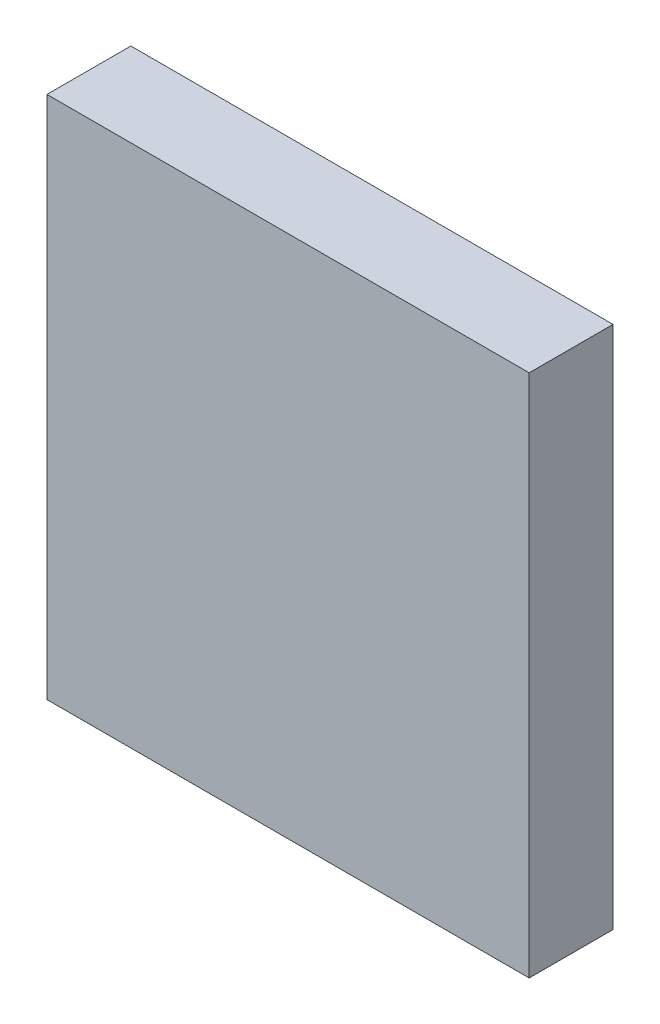
ISO-10303-21;
HEADER;
FILE_DESCRIPTION(('STEP AP214'),'2;1');
FILE_NAME('part.step','',(''),(''),'','','');
FILE_SCHEMA(('AUTOMOTIVE_DESIGN { 1 0 10303 214 1 1 1 1 }'));
ENDSEC;
DATA;
#1=APPLICATION_CONTEXT('core data for automotive mechanical design processes');
#2=APPLICATION_PROTOCOL_DEFINITION('international standard','automotive_design',2000,#1);
#3=PRODUCT_CONTEXT('',#1,'mechanical');
#4=PRODUCT('Part','Part','',(#3));
#5=PRODUCT_RELATED_PRODUCT_CATEGORY('part','',(#4));
#6=PRODUCT_DEFINITION_FORMATION('','',#4);
#7=PRODUCT_DEFINITION_CONTEXT('part definition',#1,'design');
#8=PRODUCT_DEFINITION('design','',#6,#7);
#9=PRODUCT_DEFINITION_SHAPE('','',#8);
#10=(LENGTH_UNIT() NAMED_UNIT(*) SI_UNIT(.MILLI.,.METRE.));
#11=(NAMED_UNIT(*) PLANE_ANGLE_UNIT() SI_UNIT($,.RADIAN.));
#12=(NAMED_UNIT(*) SI_UNIT($,.STERADIAN.) SOLID_ANGLE_UNIT());
#13=UNCERTAINTY_MEASURE_WITH_UNIT(LENGTH_MEASURE(1.E-05),#10,'distance_accuracy_value','');
#14=(GEOMETRIC_REPRESENTATION_CONTEXT(3) GLOBAL_UNCERTAINTY_ASSIGNED_CONTEXT((#13)) GLOBAL_UNIT_ASSIGNED_CONTEXT((#10,
#11,#12)) REPRESENTATION_CONTEXT('',''));
#15=CARTESIAN_POINT('',(0.,0.,0.));
#16=DIRECTION('',(0.,0.,1.));
#17=DIRECTION('',(1.,0.,0.));
#18=AXIS2_PLACEMENT_3D('',#15,#16,#17);
#19=CARTESIAN_POINT('',(26.1529283746728,-26.0331718721825,8.));
#20=DIRECTION('',(-1.,0.,0.));
#21=DIRECTION('',(0.,0.,1.));
#22=AXIS2_PLACEMENT_3D('',#19,#20,#21);
#23=PLANE('',#22);
#24=DIRECTION('',(0.,1.,0.));
#25=VECTOR('',#24,1.);
#26=CARTESIAN_POINT('',(26.1529283746728,-26.0331718721825,0.));
#27=LINE('',#26,#25);
#28=CARTESIAN_POINT('',(26.1529283746728,-26.0331718721825,0.));
#29=VERTEX_POINT('',#28);
#30=CARTESIAN_POINT('',(26.1529283746728,23.9668281278175,0.));
#31=VERTEX_POINT('',#30);
#32=EDGE_CURVE('E100',#29,#31,#27,.T.);
#33=ORIENTED_EDGE('',*,*,#32,.T.);
#34=DIRECTION('',(0.,0.,-1.));
#35=VECTOR('',#34,1.);
#36=CARTESIAN_POINT('',(26.1529283746728,23.9668281278175,8.));
#37=LINE('',#36,#35);
#38=CARTESIAN_POINT('',(26.1529283746728,23.9668281278175,8.));
#39=VERTEX_POINT('',#38);
#40=EDGE_CURVE('E11',#39,#31,#37,.T.);
#41=ORIENTED_EDGE('',*,*,#40,.F.);
#42=DIRECTION('',(0.,1.,0.));
#43=VECTOR('',#42,1.);
#44=CARTESIAN_POINT('',(26.1529283746728,-26.0331718721825,8.));
#45=LINE('',#44,#43);
#46=CARTESIAN_POINT('',(26.1529283746728,-26.0331718721825,8.));
#47=VERTEX_POINT('',#46);
#48=EDGE_CURVE('E88',#47,#39,#45,.T.);
#49=ORIENTED_EDGE('',*,*,#48,.F.);
#50=DIRECTION('',(0.,0.,-1.));
#51=VECTOR('',#50,1.);
#52=CARTESIAN_POINT('',(26.1529283746728,-26.0331718721825,8.));
#53=LINE('',#52,#51);
#54=EDGE_CURVE('E96',#47,#29,#53,.T.);
#55=ORIENTED_EDGE('',*,*,#54,.T.);
#56=EDGE_LOOP('',(#33,#41,#49,#55));
#57=FACE_BOUND('',#56,.T.);
#58=ADVANCED_FACE('F37',(#57),#23,.F.);
#59=CARTESIAN_POINT('',(-19.8470716253272,23.9668281278175,8.));
#60=DIRECTION('',(0.,-1.,0.));
#61=DIRECTION('',(0.,0.,-1.));
#62=AXIS2_PLACEMENT_3D('',#59,#60,#61);
#63=PLANE('',#62);
#64=DIRECTION('',(-1.,0.,0.));
#65=VECTOR('',#64,1.);
#66=CARTESIAN_POINT('',(-19.8470716253272,23.9668281278175,0.));
#67=LINE('',#66,#65);
#68=CARTESIAN_POINT('',(-19.8470716253272,23.9668281278175,0.));
#69=VERTEX_POINT('',#68);
#70=EDGE_CURVE('E92',#31,#69,#67,.T.);
#71=ORIENTED_EDGE('',*,*,#70,.T.);
#72=DIRECTION('',(0.,0.,-1.));
#73=VECTOR('',#72,1.);
#74=CARTESIAN_POINT('',(-19.8470716253272,23.9668281278175,8.));
#75=LINE('',#74,#73);
#76=CARTESIAN_POINT('',(-19.8470716253272,23.9668281278175,8.));
#77=VERTEX_POINT('',#76);
#78=EDGE_CURVE('E45',#77,#69,#75,.T.);
#79=ORIENTED_EDGE('',*,*,#78,.F.);
#80=DIRECTION('',(-1.,0.,0.));
#81=VECTOR('',#80,1.);
#82=CARTESIAN_POINT('',(-19.8470716253272,23.9668281278175,8.));
#83=LINE('',#82,#81);
#84=EDGE_CURVE('E83',#39,#77,#83,.T.);
#85=ORIENTED_EDGE('',*,*,#84,.F.);
#86=ORIENTED_EDGE('',*,*,#40,.T.);
#87=EDGE_LOOP('',(#71,#79,#85,#86));
#88=FACE_BOUND('',#87,.T.);
#89=ADVANCED_FACE('F91',(#88),#63,.F.);
#90=CARTESIAN_POINT('',(-19.8470716253272,-26.0331718721825,8.));
#91=DIRECTION('',(1.,0.,0.));
#92=DIRECTION('',(0.,0.,-1.));
#93=AXIS2_PLACEMENT_3D('',#90,#91,#92);
#94=PLANE('',#93);
#95=DIRECTION('',(0.,-1.,0.));
#96=VECTOR('',#95,1.);
#97=CARTESIAN_POINT('',(-19.8470716253272,-26.0331718721825,0.));
#98=LINE('',#97,#96);
#99=CARTESIAN_POINT('',(-19.8470716253272,-26.0331718721825,0.));
#100=VERTEX_POINT('',#99);
#101=EDGE_CURVE('E70',#69,#100,#98,.T.);
#102=ORIENTED_EDGE('',*,*,#101,.T.);
#103=DIRECTION('',(0.,0.,-1.));
#104=VECTOR('',#103,1.);
#105=CARTESIAN_POINT('',(-19.8470716253272,-26.0331718721825,8.));
#106=LINE('',#105,#104);
#107=CARTESIAN_POINT('',(-19.8470716253272,-26.0331718721825,8.));
#108=VERTEX_POINT('',#107);
#109=EDGE_CURVE('E93',#108,#100,#106,.T.);
#110=ORIENTED_EDGE('',*,*,#109,.F.);
#111=DIRECTION('',(0.,-1.,0.));
#112=VECTOR('',#111,1.);
#113=CARTESIAN_POINT('',(-19.8470716253272,-26.0331718721825,8.));
#114=LINE('',#113,#112);
#115=EDGE_CURVE('E86',#77,#108,#114,.T.);
#116=ORIENTED_EDGE('',*,*,#115,.F.);
#117=ORIENTED_EDGE('',*,*,#78,.T.);
#118=EDGE_LOOP('',(#102,#110,#116,#117));
#119=FACE_BOUND('',#118,.T.);
#120=ADVANCED_FACE('F94',(#119),#94,.F.);
#121=CARTESIAN_POINT('',(-19.8470716253272,-26.0331718721825,8.));
#122=DIRECTION('',(0.,1.,0.));
#123=DIRECTION('',(0.,0.,1.));
#124=AXIS2_PLACEMENT_3D('',#121,#122,#123);
#125=PLANE('',#124);
#126=DIRECTION('',(1.,0.,0.));
#127=VECTOR('',#126,1.);
#128=CARTESIAN_POINT('',(-19.8470716253272,-26.0331718721825,0.));
#129=LINE('',#128,#127);
#130=EDGE_CURVE('E76',#100,#29,#129,.T.);
#131=ORIENTED_EDGE('',*,*,#130,.T.);
#132=ORIENTED_EDGE('',*,*,#54,.F.);
#133=DIRECTION('',(1.,0.,0.));
#134=VECTOR('',#133,1.);
#135=CARTESIAN_POINT('',(-19.8470716253272,-26.0331718721825,8.));
#136=LINE('',#135,#134);
#137=EDGE_CURVE('E53',#108,#47,#136,.T.);
#138=ORIENTED_EDGE('',*,*,#137,.F.);
#139=ORIENTED_EDGE('',*,*,#109,.T.);
#140=EDGE_LOOP('',(#131,#132,#138,#139));
#141=FACE_BOUND('',#140,.T.);
#142=ADVANCED_FACE('F107',(#141),#125,.F.);
#143=CARTESIAN_POINT('',(0.,0.,8.));
#144=DIRECTION('',(0.,0.,-1.));
#145=DIRECTION('',(-1.,0.,0.));
#146=AXIS2_PLACEMENT_3D('',#143,#144,#145);
#147=PLANE('',#146);
#148=ORIENTED_EDGE('',*,*,#48,.T.);
#149=ORIENTED_EDGE('',*,*,#84,.T.);
#150=ORIENTED_EDGE('',*,*,#115,.T.);
#151=ORIENTED_EDGE('',*,*,#137,.T.);
#152=EDGE_LOOP('',(#148,#149,#150,#151));
#153=FACE_BOUND('',#152,.T.);
#154=ADVANCED_FACE('F84',(#153),#147,.F.);
#155=CARTESIAN_POINT('',(0.,0.,0.));
#156=DIRECTION('',(0.,0.,-1.));
#157=DIRECTION('',(-1.,0.,0.));
#158=AXIS2_PLACEMENT_3D('',#155,#156,#157);
#159=PLANE('',#158);
#160=ORIENTED_EDGE('',*,*,#32,.F.);
#161=ORIENTED_EDGE('',*,*,#130,.F.);
#162=ORIENTED_EDGE('',*,*,#101,.F.);
#163=ORIENTED_EDGE('',*,*,#70,.F.);
#164=EDGE_LOOP('',(#160,#161,#162,#163));
#165=FACE_BOUND('',#164,.T.);
#166=ADVANCED_FACE('F110',(#165),#159,.T.);
#167=CLOSED_SHELL('',(#58,#89,#120,#142,#154,#166));
#168=MANIFOLD_SOLID_BREP('B2',#167);
#169=ADVANCED_BREP_SHAPE_REPRESENTATION('',(#18,#168),#14);
#170=SHAPE_DEFINITION_REPRESENTATION(#9,#169);
ENDSEC;
END-ISO-10303-21;
